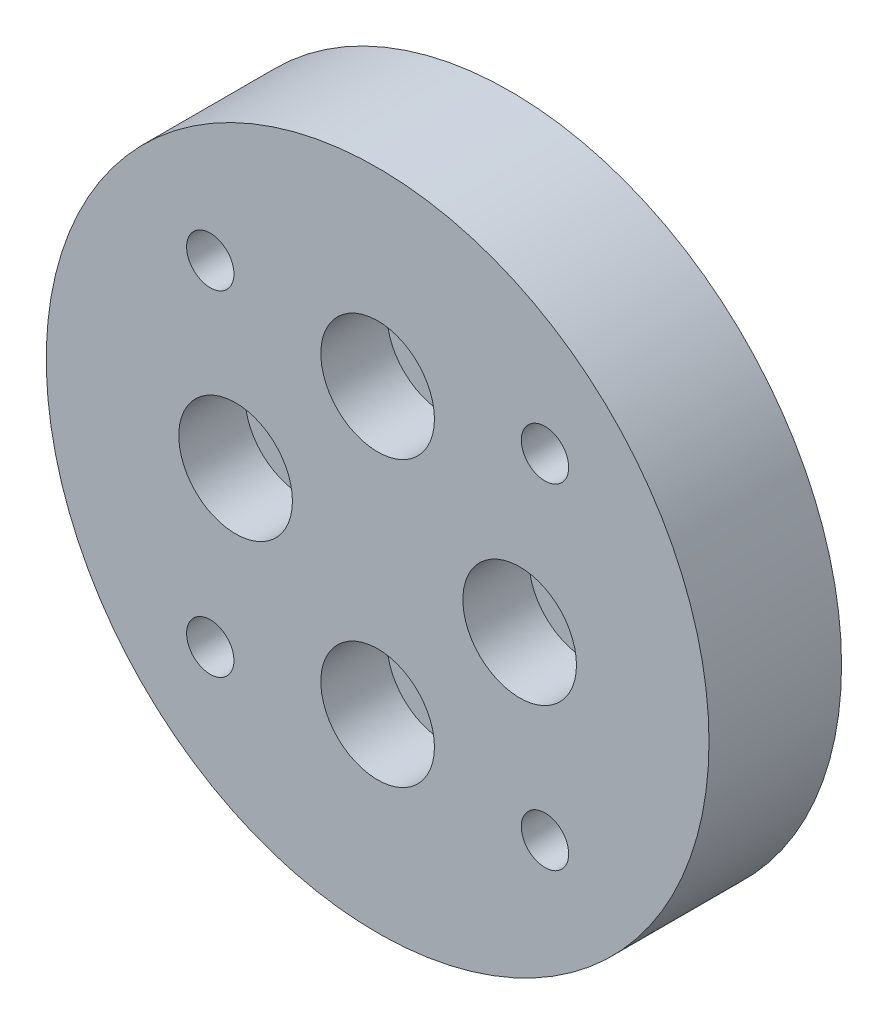
ISO-10303-21;
HEADER;
FILE_DESCRIPTION(('STEP AP214'),'2;1');
FILE_NAME('part.step','',(''),(''),'','','');
FILE_SCHEMA(('AUTOMOTIVE_DESIGN { 1 0 10303 214 1 1 1 1 }'));
ENDSEC;
DATA;
#1=APPLICATION_CONTEXT('core data for automotive mechanical design processes');
#2=APPLICATION_PROTOCOL_DEFINITION('international standard','automotive_design',2000,#1);
#3=PRODUCT_CONTEXT('',#1,'mechanical');
#4=PRODUCT('Part','Part','',(#3));
#5=PRODUCT_RELATED_PRODUCT_CATEGORY('part','',(#4));
#6=PRODUCT_DEFINITION_FORMATION('','',#4);
#7=PRODUCT_DEFINITION_CONTEXT('part definition',#1,'design');
#8=PRODUCT_DEFINITION('design','',#6,#7);
#9=PRODUCT_DEFINITION_SHAPE('','',#8);
#10=(LENGTH_UNIT() NAMED_UNIT(*) SI_UNIT(.MILLI.,.METRE.));
#11=(NAMED_UNIT(*) PLANE_ANGLE_UNIT() SI_UNIT($,.RADIAN.));
#12=(NAMED_UNIT(*) SI_UNIT($,.STERADIAN.) SOLID_ANGLE_UNIT());
#13=UNCERTAINTY_MEASURE_WITH_UNIT(LENGTH_MEASURE(1.E-05),#10,'distance_accuracy_value','');
#14=(GEOMETRIC_REPRESENTATION_CONTEXT(3) GLOBAL_UNCERTAINTY_ASSIGNED_CONTEXT((#13)) GLOBAL_UNIT_ASSIGNED_CONTEXT((#10,
#11,#12)) REPRESENTATION_CONTEXT('',''));
#15=CARTESIAN_POINT('',(0.,0.,0.));
#16=DIRECTION('',(0.,0.,1.));
#17=DIRECTION('',(1.,0.,0.));
#18=AXIS2_PLACEMENT_3D('',#15,#16,#17);
#19=CARTESIAN_POINT('',(0.,7.5,7.));
#20=DIRECTION('',(0.,0.,-1.));
#21=DIRECTION('',(-1.,0.,0.));
#22=AXIS2_PLACEMENT_3D('',#19,#20,#21);
#23=CYLINDRICAL_SURFACE('',#22,1.25);
#24=CARTESIAN_POINT('',(0.,7.5,0.));
#25=DIRECTION('',(0.,0.,1.));
#26=DIRECTION('',(1.,0.,0.));
#27=AXIS2_PLACEMENT_3D('',#24,#25,#26);
#28=CIRCLE('',#27,1.25);
#29=CARTESIAN_POINT('',(1.25,7.5,0.));
#30=VERTEX_POINT('',#29);
#31=EDGE_CURVE('E50',#30,#30,#28,.T.);
#32=ORIENTED_EDGE('',*,*,#31,.F.);
#33=EDGE_LOOP('',(#32));
#34=FACE_BOUND('',#33,.T.);
#35=CARTESIAN_POINT('',(0.,7.5,3.5));
#36=DIRECTION('',(0.,0.,1.));
#37=DIRECTION('',(1.,0.,0.));
#38=AXIS2_PLACEMENT_3D('',#35,#36,#37);
#39=CIRCLE('',#38,1.25);
#40=CARTESIAN_POINT('',(1.25,7.5,3.5));
#41=VERTEX_POINT('',#40);
#42=EDGE_CURVE('E41',#41,#41,#39,.T.);
#43=ORIENTED_EDGE('',*,*,#42,.T.);
#44=EDGE_LOOP('',(#43));
#45=FACE_BOUND('',#44,.T.);
#46=ADVANCED_FACE('F37',(#34,#45),#23,.F.);
#47=CARTESIAN_POINT('',(7.5,0.,7.));
#48=DIRECTION('',(0.,0.,-1.));
#49=DIRECTION('',(-1.,0.,0.));
#50=AXIS2_PLACEMENT_3D('',#47,#48,#49);
#51=CYLINDRICAL_SURFACE('',#50,1.25);
#52=CARTESIAN_POINT('',(7.5,0.,0.));
#53=DIRECTION('',(0.,0.,1.));
#54=DIRECTION('',(1.,0.,0.));
#55=AXIS2_PLACEMENT_3D('',#52,#53,#54);
#56=CIRCLE('',#55,1.25);
#57=CARTESIAN_POINT('',(8.75,0.,0.));
#58=VERTEX_POINT('',#57);
#59=EDGE_CURVE('E96',#58,#58,#56,.T.);
#60=ORIENTED_EDGE('',*,*,#59,.F.);
#61=EDGE_LOOP('',(#60));
#62=FACE_BOUND('',#61,.T.);
#63=CARTESIAN_POINT('',(7.5,0.,3.5));
#64=DIRECTION('',(0.,0.,1.));
#65=DIRECTION('',(1.,0.,0.));
#66=AXIS2_PLACEMENT_3D('',#63,#64,#65);
#67=CIRCLE('',#66,1.25);
#68=CARTESIAN_POINT('',(8.75,0.,3.5));
#69=VERTEX_POINT('',#68);
#70=EDGE_CURVE('E61',#69,#69,#67,.T.);
#71=ORIENTED_EDGE('',*,*,#70,.T.);
#72=EDGE_LOOP('',(#71));
#73=FACE_BOUND('',#72,.T.);
#74=ADVANCED_FACE('F124',(#62,#73),#51,.F.);
#75=CARTESIAN_POINT('',(0.,-7.5,7.));
#76=DIRECTION('',(0.,0.,-1.));
#77=DIRECTION('',(-1.,0.,0.));
#78=AXIS2_PLACEMENT_3D('',#75,#76,#77);
#79=CYLINDRICAL_SURFACE('',#78,1.25);
#80=CARTESIAN_POINT('',(0.,-7.5,0.));
#81=DIRECTION('',(0.,0.,1.));
#82=DIRECTION('',(1.,0.,0.));
#83=AXIS2_PLACEMENT_3D('',#80,#81,#82);
#84=CIRCLE('',#83,1.25);
#85=CARTESIAN_POINT('',(1.25,-7.5,0.));
#86=VERTEX_POINT('',#85);
#87=EDGE_CURVE('E93',#86,#86,#84,.T.);
#88=ORIENTED_EDGE('',*,*,#87,.F.);
#89=EDGE_LOOP('',(#88));
#90=FACE_BOUND('',#89,.T.);
#91=CARTESIAN_POINT('',(0.,-7.5,3.5));
#92=DIRECTION('',(0.,0.,1.));
#93=DIRECTION('',(1.,0.,0.));
#94=AXIS2_PLACEMENT_3D('',#91,#92,#93);
#95=CIRCLE('',#94,1.25);
#96=CARTESIAN_POINT('',(1.25,-7.5,3.5));
#97=VERTEX_POINT('',#96);
#98=EDGE_CURVE('E58',#97,#97,#95,.T.);
#99=ORIENTED_EDGE('',*,*,#98,.T.);
#100=EDGE_LOOP('',(#99));
#101=FACE_BOUND('',#100,.T.);
#102=ADVANCED_FACE('F129',(#90,#101),#79,.F.);
#103=CARTESIAN_POINT('',(-7.5,0.,7.));
#104=DIRECTION('',(0.,0.,-1.));
#105=DIRECTION('',(-1.,0.,0.));
#106=AXIS2_PLACEMENT_3D('',#103,#104,#105);
#107=CYLINDRICAL_SURFACE('',#106,1.25);
#108=CARTESIAN_POINT('',(-7.5,0.,0.));
#109=DIRECTION('',(0.,0.,1.));
#110=DIRECTION('',(1.,0.,0.));
#111=AXIS2_PLACEMENT_3D('',#108,#109,#110);
#112=CIRCLE('',#111,1.25);
#113=CARTESIAN_POINT('',(-6.25,0.,0.));
#114=VERTEX_POINT('',#113);
#115=EDGE_CURVE('E88',#114,#114,#112,.T.);
#116=ORIENTED_EDGE('',*,*,#115,.F.);
#117=EDGE_LOOP('',(#116));
#118=FACE_BOUND('',#117,.T.);
#119=CARTESIAN_POINT('',(-7.5,0.,3.5));
#120=DIRECTION('',(0.,0.,1.));
#121=DIRECTION('',(1.,0.,0.));
#122=AXIS2_PLACEMENT_3D('',#119,#120,#121);
#123=CIRCLE('',#122,1.25);
#124=CARTESIAN_POINT('',(-6.25,0.,3.5));
#125=VERTEX_POINT('',#124);
#126=EDGE_CURVE('E55',#125,#125,#123,.T.);
#127=ORIENTED_EDGE('',*,*,#126,.T.);
#128=EDGE_LOOP('',(#127));
#129=FACE_BOUND('',#128,.T.);
#130=ADVANCED_FACE('F135',(#118,#129),#107,.F.);
#131=CARTESIAN_POINT('',(0.,0.,7.));
#132=DIRECTION('',(0.,0.,1.));
#133=DIRECTION('',(1.,0.,0.));
#134=AXIS2_PLACEMENT_3D('',#131,#132,#133);
#135=PLANE('',#134);
#136=CARTESIAN_POINT('',(0.,7.5,7.));
#137=DIRECTION('',(0.,0.,1.));
#138=DIRECTION('',(1.,0.,0.));
#139=AXIS2_PLACEMENT_3D('',#136,#137,#138);
#140=CIRCLE('',#139,3.);
#141=CARTESIAN_POINT('',(3.,7.5,7.));
#142=VERTEX_POINT('',#141);
#143=EDGE_CURVE('E331',#142,#142,#140,.T.);
#144=ORIENTED_EDGE('',*,*,#143,.F.);
#145=EDGE_LOOP('',(#144));
#146=FACE_BOUND('',#145,.T.);
#147=CARTESIAN_POINT('',(7.5,0.,7.));
#148=DIRECTION('',(0.,0.,1.));
#149=DIRECTION('',(1.,0.,0.));
#150=AXIS2_PLACEMENT_3D('',#147,#148,#149);
#151=CIRCLE('',#150,3.);
#152=CARTESIAN_POINT('',(10.5,0.,7.));
#153=VERTEX_POINT('',#152);
#154=EDGE_CURVE('E334',#153,#153,#151,.T.);
#155=ORIENTED_EDGE('',*,*,#154,.F.);
#156=EDGE_LOOP('',(#155));
#157=FACE_BOUND('',#156,.T.);
#158=CARTESIAN_POINT('',(0.,-7.5,7.));
#159=DIRECTION('',(0.,0.,1.));
#160=DIRECTION('',(1.,0.,0.));
#161=AXIS2_PLACEMENT_3D('',#158,#159,#160);
#162=CIRCLE('',#161,3.);
#163=CARTESIAN_POINT('',(3.,-7.5,7.));
#164=VERTEX_POINT('',#163);
#165=EDGE_CURVE('E342',#164,#164,#162,.T.);
#166=ORIENTED_EDGE('',*,*,#165,.F.);
#167=EDGE_LOOP('',(#166));
#168=FACE_BOUND('',#167,.T.);
#169=CARTESIAN_POINT('',(-7.5,0.,7.));
#170=DIRECTION('',(0.,0.,1.));
#171=DIRECTION('',(1.,0.,0.));
#172=AXIS2_PLACEMENT_3D('',#169,#170,#171);
#173=CIRCLE('',#172,3.);
#174=CARTESIAN_POINT('',(-4.5,0.,7.));
#175=VERTEX_POINT('',#174);
#176=EDGE_CURVE('E348',#175,#175,#173,.T.);
#177=ORIENTED_EDGE('',*,*,#176,.F.);
#178=EDGE_LOOP('',(#177));
#179=FACE_BOUND('',#178,.T.);
#180=CARTESIAN_POINT('',(-8.83883476483186,-8.83883476483183,7.));
#181=DIRECTION('',(0.,0.,1.));
#182=DIRECTION('',(1.,0.,0.));
#183=AXIS2_PLACEMENT_3D('',#180,#181,#182);
#184=CIRCLE('',#183,1.25);
#185=CARTESIAN_POINT('',(-7.58883476483186,-8.83883476483183,7.));
#186=VERTEX_POINT('',#185);
#187=EDGE_CURVE('E79',#186,#186,#184,.T.);
#188=ORIENTED_EDGE('',*,*,#187,.F.);
#189=EDGE_LOOP('',(#188));
#190=FACE_BOUND('',#189,.T.);
#191=CARTESIAN_POINT('',(0.,0.,7.));
#192=DIRECTION('',(0.,0.,1.));
#193=DIRECTION('',(1.,0.,0.));
#194=AXIS2_PLACEMENT_3D('',#191,#192,#193);
#195=CIRCLE('',#194,17.5);
#196=CARTESIAN_POINT('',(17.5,0.,7.));
#197=VERTEX_POINT('',#196);
#198=EDGE_CURVE('E10',#197,#197,#195,.T.);
#199=ORIENTED_EDGE('',*,*,#198,.T.);
#200=EDGE_LOOP('',(#199));
#201=FACE_BOUND('',#200,.T.);
#202=CARTESIAN_POINT('',(8.83883476483186,8.83883476483183,7.));
#203=DIRECTION('',(0.,0.,1.));
#204=DIRECTION('',(1.,0.,0.));
#205=AXIS2_PLACEMENT_3D('',#202,#203,#204);
#206=CIRCLE('',#205,1.25);
#207=CARTESIAN_POINT('',(10.0888347648319,8.83883476483183,7.));
#208=VERTEX_POINT('',#207);
#209=EDGE_CURVE('E100',#208,#208,#206,.T.);
#210=ORIENTED_EDGE('',*,*,#209,.F.);
#211=EDGE_LOOP('',(#210));
#212=FACE_BOUND('',#211,.T.);
#213=CARTESIAN_POINT('',(8.83883476483183,-8.83883476483186,7.));
#214=DIRECTION('',(0.,0.,1.));
#215=DIRECTION('',(1.,0.,0.));
#216=AXIS2_PLACEMENT_3D('',#213,#214,#215);
#217=CIRCLE('',#216,1.25);
#218=CARTESIAN_POINT('',(10.0888347648318,-8.83883476483186,7.));
#219=VERTEX_POINT('',#218);
#220=EDGE_CURVE('E85',#219,#219,#217,.T.);
#221=ORIENTED_EDGE('',*,*,#220,.F.);
#222=EDGE_LOOP('',(#221));
#223=FACE_BOUND('',#222,.T.);
#224=CARTESIAN_POINT('',(-8.83883476483183,8.83883476483186,7.));
#225=DIRECTION('',(0.,0.,1.));
#226=DIRECTION('',(1.,0.,0.));
#227=AXIS2_PLACEMENT_3D('',#224,#225,#226);
#228=CIRCLE('',#227,1.25);
#229=CARTESIAN_POINT('',(-7.58883476483183,8.83883476483186,7.));
#230=VERTEX_POINT('',#229);
#231=EDGE_CURVE('E70',#230,#230,#228,.T.);
#232=ORIENTED_EDGE('',*,*,#231,.F.);
#233=EDGE_LOOP('',(#232));
#234=FACE_BOUND('',#233,.T.);
#235=ADVANCED_FACE('F133',(#146,#157,#168,#179,#190,#201,#212,#223,#234),#135,.T.);
#236=CARTESIAN_POINT('',(0.,0.,0.));
#237=DIRECTION('',(0.,0.,1.));
#238=DIRECTION('',(1.,0.,0.));
#239=AXIS2_PLACEMENT_3D('',#236,#237,#238);
#240=PLANE('',#239);
#241=CARTESIAN_POINT('',(0.,0.,0.));
#242=DIRECTION('',(0.,0.,1.));
#243=DIRECTION('',(1.,0.,0.));
#244=AXIS2_PLACEMENT_3D('',#241,#242,#243);
#245=CIRCLE('',#244,17.5);
#246=CARTESIAN_POINT('',(17.5,0.,0.));
#247=VERTEX_POINT('',#246);
#248=EDGE_CURVE('E45',#247,#247,#245,.T.);
#249=ORIENTED_EDGE('',*,*,#248,.F.);
#250=EDGE_LOOP('',(#249));
#251=FACE_BOUND('',#250,.T.);
#252=ORIENTED_EDGE('',*,*,#31,.T.);
#253=EDGE_LOOP('',(#252));
#254=FACE_BOUND('',#253,.T.);
#255=CARTESIAN_POINT('',(8.83883476483186,8.83883476483183,0.));
#256=DIRECTION('',(0.,0.,1.));
#257=DIRECTION('',(1.,0.,0.));
#258=AXIS2_PLACEMENT_3D('',#255,#256,#257);
#259=CIRCLE('',#258,1.25);
#260=CARTESIAN_POINT('',(10.0888347648319,8.83883476483183,0.));
#261=VERTEX_POINT('',#260);
#262=EDGE_CURVE('E99',#261,#261,#259,.T.);
#263=ORIENTED_EDGE('',*,*,#262,.T.);
#264=EDGE_LOOP('',(#263));
#265=FACE_BOUND('',#264,.T.);
#266=ORIENTED_EDGE('',*,*,#59,.T.);
#267=EDGE_LOOP('',(#266));
#268=FACE_BOUND('',#267,.T.);
#269=ORIENTED_EDGE('',*,*,#87,.T.);
#270=EDGE_LOOP('',(#269));
#271=FACE_BOUND('',#270,.T.);
#272=ORIENTED_EDGE('',*,*,#115,.T.);
#273=EDGE_LOOP('',(#272));
#274=FACE_BOUND('',#273,.T.);
#275=CARTESIAN_POINT('',(8.83883476483183,-8.83883476483186,0.));
#276=DIRECTION('',(0.,0.,1.));
#277=DIRECTION('',(1.,0.,0.));
#278=AXIS2_PLACEMENT_3D('',#275,#276,#277);
#279=CIRCLE('',#278,1.25);
#280=CARTESIAN_POINT('',(10.0888347648318,-8.83883476483186,0.));
#281=VERTEX_POINT('',#280);
#282=EDGE_CURVE('E82',#281,#281,#279,.T.);
#283=ORIENTED_EDGE('',*,*,#282,.T.);
#284=EDGE_LOOP('',(#283));
#285=FACE_BOUND('',#284,.T.);
#286=CARTESIAN_POINT('',(-8.83883476483186,-8.83883476483183,0.));
#287=DIRECTION('',(0.,0.,1.));
#288=DIRECTION('',(1.,0.,0.));
#289=AXIS2_PLACEMENT_3D('',#286,#287,#288);
#290=CIRCLE('',#289,1.25);
#291=CARTESIAN_POINT('',(-7.58883476483186,-8.83883476483183,0.));
#292=VERTEX_POINT('',#291);
#293=EDGE_CURVE('E75',#292,#292,#290,.T.);
#294=ORIENTED_EDGE('',*,*,#293,.T.);
#295=EDGE_LOOP('',(#294));
#296=FACE_BOUND('',#295,.T.);
#297=CARTESIAN_POINT('',(-8.83883476483183,8.83883476483186,0.));
#298=DIRECTION('',(0.,0.,1.));
#299=DIRECTION('',(1.,0.,0.));
#300=AXIS2_PLACEMENT_3D('',#297,#298,#299);
#301=CIRCLE('',#300,1.25);
#302=CARTESIAN_POINT('',(-7.58883476483183,8.83883476483186,0.));
#303=VERTEX_POINT('',#302);
#304=EDGE_CURVE('E66',#303,#303,#301,.T.);
#305=ORIENTED_EDGE('',*,*,#304,.T.);
#306=EDGE_LOOP('',(#305));
#307=FACE_BOUND('',#306,.T.);
#308=ADVANCED_FACE('F105',(#251,#254,#265,#268,#271,#274,#285,#296,#307),#240,.F.);
#309=CARTESIAN_POINT('',(0.,0.,7.));
#310=DIRECTION('',(0.,0.,-1.));
#311=DIRECTION('',(-1.,0.,0.));
#312=AXIS2_PLACEMENT_3D('',#309,#310,#311);
#313=CYLINDRICAL_SURFACE('',#312,17.5);
#314=ORIENTED_EDGE('',*,*,#198,.F.);
#315=EDGE_LOOP('',(#314));
#316=FACE_BOUND('',#315,.T.);
#317=ORIENTED_EDGE('',*,*,#248,.T.);
#318=EDGE_LOOP('',(#317));
#319=FACE_BOUND('',#318,.T.);
#320=ADVANCED_FACE('F39',(#316,#319),#313,.T.);
#321=CARTESIAN_POINT('',(8.83883476483186,8.83883476483183,7.));
#322=DIRECTION('',(0.,0.,-1.));
#323=DIRECTION('',(-1.,0.,0.));
#324=AXIS2_PLACEMENT_3D('',#321,#322,#323);
#325=CYLINDRICAL_SURFACE('',#324,1.25);
#326=ORIENTED_EDGE('',*,*,#209,.T.);
#327=EDGE_LOOP('',(#326));
#328=FACE_BOUND('',#327,.T.);
#329=ORIENTED_EDGE('',*,*,#262,.F.);
#330=EDGE_LOOP('',(#329));
#331=FACE_BOUND('',#330,.T.);
#332=ADVANCED_FACE('F108',(#328,#331),#325,.F.);
#333=CARTESIAN_POINT('',(8.83883476483183,-8.83883476483186,7.));
#334=DIRECTION('',(0.,0.,-1.));
#335=DIRECTION('',(-1.,0.,0.));
#336=AXIS2_PLACEMENT_3D('',#333,#334,#335);
#337=CYLINDRICAL_SURFACE('',#336,1.25);
#338=ORIENTED_EDGE('',*,*,#220,.T.);
#339=EDGE_LOOP('',(#338));
#340=FACE_BOUND('',#339,.T.);
#341=ORIENTED_EDGE('',*,*,#282,.F.);
#342=EDGE_LOOP('',(#341));
#343=FACE_BOUND('',#342,.T.);
#344=ADVANCED_FACE('F110',(#340,#343),#337,.F.);
#345=CARTESIAN_POINT('',(-8.83883476483186,-8.83883476483183,7.));
#346=DIRECTION('',(0.,0.,-1.));
#347=DIRECTION('',(-1.,0.,0.));
#348=AXIS2_PLACEMENT_3D('',#345,#346,#347);
#349=CYLINDRICAL_SURFACE('',#348,1.25);
#350=ORIENTED_EDGE('',*,*,#187,.T.);
#351=EDGE_LOOP('',(#350));
#352=FACE_BOUND('',#351,.T.);
#353=ORIENTED_EDGE('',*,*,#293,.F.);
#354=EDGE_LOOP('',(#353));
#355=FACE_BOUND('',#354,.T.);
#356=ADVANCED_FACE('F117',(#352,#355),#349,.F.);
#357=CARTESIAN_POINT('',(-8.83883476483183,8.83883476483186,7.));
#358=DIRECTION('',(0.,0.,-1.));
#359=DIRECTION('',(-1.,0.,0.));
#360=AXIS2_PLACEMENT_3D('',#357,#358,#359);
#361=CYLINDRICAL_SURFACE('',#360,1.25);
#362=ORIENTED_EDGE('',*,*,#231,.T.);
#363=EDGE_LOOP('',(#362));
#364=FACE_BOUND('',#363,.T.);
#365=ORIENTED_EDGE('',*,*,#304,.F.);
#366=EDGE_LOOP('',(#365));
#367=FACE_BOUND('',#366,.T.);
#368=ADVANCED_FACE('F179',(#364,#367),#361,.F.);
#369=CARTESIAN_POINT('',(-7.5,0.,3.5));
#370=DIRECTION('',(0.,0.,1.));
#371=DIRECTION('',(1.,0.,0.));
#372=AXIS2_PLACEMENT_3D('',#369,#370,#371);
#373=CYLINDRICAL_SURFACE('',#372,3.);
#374=CARTESIAN_POINT('',(-7.5,0.,3.5));
#375=DIRECTION('',(0.,0.,1.));
#376=DIRECTION('',(1.,0.,0.));
#377=AXIS2_PLACEMENT_3D('',#374,#375,#376);
#378=CIRCLE('',#377,3.);
#379=CARTESIAN_POINT('',(-4.5,0.,3.5));
#380=VERTEX_POINT('',#379);
#381=EDGE_CURVE('E350',#380,#380,#378,.T.);
#382=ORIENTED_EDGE('',*,*,#381,.F.);
#383=EDGE_LOOP('',(#382));
#384=FACE_BOUND('',#383,.T.);
#385=ORIENTED_EDGE('',*,*,#176,.T.);
#386=EDGE_LOOP('',(#385));
#387=FACE_BOUND('',#386,.T.);
#388=ADVANCED_FACE('F190',(#384,#387),#373,.F.);
#389=CARTESIAN_POINT('',(-7.5,0.,3.5));
#390=DIRECTION('',(0.,0.,1.));
#391=DIRECTION('',(1.,0.,0.));
#392=AXIS2_PLACEMENT_3D('',#389,#390,#391);
#393=PLANE('',#392);
#394=ORIENTED_EDGE('',*,*,#126,.F.);
#395=EDGE_LOOP('',(#394));
#396=FACE_BOUND('',#395,.T.);
#397=ORIENTED_EDGE('',*,*,#381,.T.);
#398=EDGE_LOOP('',(#397));
#399=FACE_BOUND('',#398,.T.);
#400=ADVANCED_FACE('F239',(#396,#399),#393,.T.);
#401=CARTESIAN_POINT('',(0.,-7.5,3.5));
#402=DIRECTION('',(0.,0.,1.));
#403=DIRECTION('',(1.,0.,0.));
#404=AXIS2_PLACEMENT_3D('',#401,#402,#403);
#405=CYLINDRICAL_SURFACE('',#404,3.);
#406=CARTESIAN_POINT('',(0.,-7.5,3.5));
#407=DIRECTION('',(0.,0.,1.));
#408=DIRECTION('',(1.,0.,0.));
#409=AXIS2_PLACEMENT_3D('',#406,#407,#408);
#410=CIRCLE('',#409,3.);
#411=CARTESIAN_POINT('',(3.,-7.5,3.5));
#412=VERTEX_POINT('',#411);
#413=EDGE_CURVE('E345',#412,#412,#410,.T.);
#414=ORIENTED_EDGE('',*,*,#413,.F.);
#415=EDGE_LOOP('',(#414));
#416=FACE_BOUND('',#415,.T.);
#417=ORIENTED_EDGE('',*,*,#165,.T.);
#418=EDGE_LOOP('',(#417));
#419=FACE_BOUND('',#418,.T.);
#420=ADVANCED_FACE('F249',(#416,#419),#405,.F.);
#421=CARTESIAN_POINT('',(0.,-7.5,3.5));
#422=DIRECTION('',(0.,0.,1.));
#423=DIRECTION('',(1.,0.,0.));
#424=AXIS2_PLACEMENT_3D('',#421,#422,#423);
#425=PLANE('',#424);
#426=ORIENTED_EDGE('',*,*,#98,.F.);
#427=EDGE_LOOP('',(#426));
#428=FACE_BOUND('',#427,.T.);
#429=ORIENTED_EDGE('',*,*,#413,.T.);
#430=EDGE_LOOP('',(#429));
#431=FACE_BOUND('',#430,.T.);
#432=ADVANCED_FACE('F260',(#428,#431),#425,.T.);
#433=CARTESIAN_POINT('',(7.5,0.,3.5));
#434=DIRECTION('',(0.,0.,1.));
#435=DIRECTION('',(1.,0.,0.));
#436=AXIS2_PLACEMENT_3D('',#433,#434,#435);
#437=CYLINDRICAL_SURFACE('',#436,3.);
#438=CARTESIAN_POINT('',(7.5,0.,3.5));
#439=DIRECTION('',(0.,0.,1.));
#440=DIRECTION('',(1.,0.,0.));
#441=AXIS2_PLACEMENT_3D('',#438,#439,#440);
#442=CIRCLE('',#441,3.);
#443=CARTESIAN_POINT('',(10.5,0.,3.5));
#444=VERTEX_POINT('',#443);
#445=EDGE_CURVE('E339',#444,#444,#442,.T.);
#446=ORIENTED_EDGE('',*,*,#445,.F.);
#447=EDGE_LOOP('',(#446));
#448=FACE_BOUND('',#447,.T.);
#449=ORIENTED_EDGE('',*,*,#154,.T.);
#450=EDGE_LOOP('',(#449));
#451=FACE_BOUND('',#450,.T.);
#452=ADVANCED_FACE('F271',(#448,#451),#437,.F.);
#453=CARTESIAN_POINT('',(7.5,0.,3.5));
#454=DIRECTION('',(0.,0.,1.));
#455=DIRECTION('',(1.,0.,0.));
#456=AXIS2_PLACEMENT_3D('',#453,#454,#455);
#457=PLANE('',#456);
#458=ORIENTED_EDGE('',*,*,#70,.F.);
#459=EDGE_LOOP('',(#458));
#460=FACE_BOUND('',#459,.T.);
#461=ORIENTED_EDGE('',*,*,#445,.T.);
#462=EDGE_LOOP('',(#461));
#463=FACE_BOUND('',#462,.T.);
#464=ADVANCED_FACE('F282',(#460,#463),#457,.T.);
#465=CARTESIAN_POINT('',(0.,7.5,3.5));
#466=DIRECTION('',(0.,0.,1.));
#467=DIRECTION('',(1.,0.,0.));
#468=AXIS2_PLACEMENT_3D('',#465,#466,#467);
#469=CYLINDRICAL_SURFACE('',#468,3.);
#470=CARTESIAN_POINT('',(0.,7.5,3.5));
#471=DIRECTION('',(0.,0.,1.));
#472=DIRECTION('',(1.,0.,0.));
#473=AXIS2_PLACEMENT_3D('',#470,#471,#472);
#474=CIRCLE('',#473,3.);
#475=CARTESIAN_POINT('',(3.,7.5,3.5));
#476=VERTEX_POINT('',#475);
#477=EDGE_CURVE('E59',#476,#476,#474,.T.);
#478=ORIENTED_EDGE('',*,*,#477,.F.);
#479=EDGE_LOOP('',(#478));
#480=FACE_BOUND('',#479,.T.);
#481=ORIENTED_EDGE('',*,*,#143,.T.);
#482=EDGE_LOOP('',(#481));
#483=FACE_BOUND('',#482,.T.);
#484=ADVANCED_FACE('F293',(#480,#483),#469,.F.);
#485=CARTESIAN_POINT('',(0.,7.5,3.5));
#486=DIRECTION('',(0.,0.,1.));
#487=DIRECTION('',(1.,0.,0.));
#488=AXIS2_PLACEMENT_3D('',#485,#486,#487);
#489=PLANE('',#488);
#490=ORIENTED_EDGE('',*,*,#42,.F.);
#491=EDGE_LOOP('',(#490));
#492=FACE_BOUND('',#491,.T.);
#493=ORIENTED_EDGE('',*,*,#477,.T.);
#494=EDGE_LOOP('',(#493));
#495=FACE_BOUND('',#494,.T.);
#496=ADVANCED_FACE('F304',(#492,#495),#489,.T.);
#497=CLOSED_SHELL('',(#46,#74,#102,#130,#235,#308,#320,#332,#344,#356,#368,#388,#400,#420,#432,
#452,#464,#484,#496));
#498=MANIFOLD_SOLID_BREP('B2',#497);
#499=ADVANCED_BREP_SHAPE_REPRESENTATION('',(#18,#498),#14);
#500=SHAPE_DEFINITION_REPRESENTATION(#9,#499);
ENDSEC;
END-ISO-10303-21;
